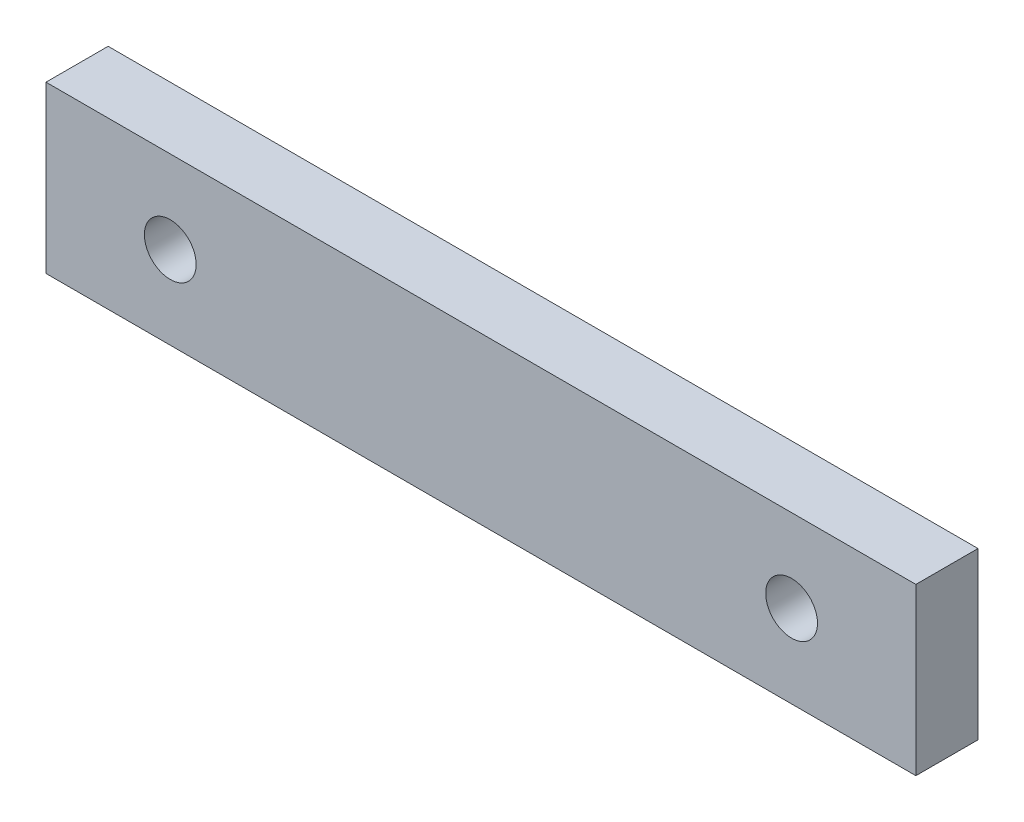
ISO-10303-21;
HEADER;
FILE_DESCRIPTION(('STEP AP214'),'2;1');
FILE_NAME('part.step','',(''),(''),'','','');
FILE_SCHEMA(('AUTOMOTIVE_DESIGN { 1 0 10303 214 1 1 1 1 }'));
ENDSEC;
DATA;
#1=APPLICATION_CONTEXT('core data for automotive mechanical design processes');
#2=APPLICATION_PROTOCOL_DEFINITION('international standard','automotive_design',2000,#1);
#3=PRODUCT_CONTEXT('',#1,'mechanical');
#4=PRODUCT('Part','Part','',(#3));
#5=PRODUCT_RELATED_PRODUCT_CATEGORY('part','',(#4));
#6=PRODUCT_DEFINITION_FORMATION('','',#4);
#7=PRODUCT_DEFINITION_CONTEXT('part definition',#1,'design');
#8=PRODUCT_DEFINITION('design','',#6,#7);
#9=PRODUCT_DEFINITION_SHAPE('','',#8);
#10=(LENGTH_UNIT() NAMED_UNIT(*) SI_UNIT(.MILLI.,.METRE.));
#11=(NAMED_UNIT(*) PLANE_ANGLE_UNIT() SI_UNIT($,.RADIAN.));
#12=(NAMED_UNIT(*) SI_UNIT($,.STERADIAN.) SOLID_ANGLE_UNIT());
#13=UNCERTAINTY_MEASURE_WITH_UNIT(LENGTH_MEASURE(1.E-05),#10,'distance_accuracy_value','');
#14=(GEOMETRIC_REPRESENTATION_CONTEXT(3) GLOBAL_UNCERTAINTY_ASSIGNED_CONTEXT((#13)) GLOBAL_UNIT_ASSIGNED_CONTEXT((#10,
#11,#12)) REPRESENTATION_CONTEXT('',''));
#15=CARTESIAN_POINT('',(0.,0.,0.));
#16=DIRECTION('',(0.,0.,1.));
#17=DIRECTION('',(1.,0.,0.));
#18=AXIS2_PLACEMENT_3D('',#15,#16,#17);
#19=CARTESIAN_POINT('',(0.,0.,15.));
#20=DIRECTION('',(0.,1.,0.));
#21=DIRECTION('',(0.,0.,1.));
#22=AXIS2_PLACEMENT_3D('',#19,#20,#21);
#23=PLANE('',#22);
#24=DIRECTION('',(1.,0.,0.));
#25=VECTOR('',#24,1.);
#26=CARTESIAN_POINT('',(0.,0.,0.));
#27=LINE('',#26,#25);
#28=CARTESIAN_POINT('',(0.,0.,0.));
#29=VERTEX_POINT('',#28);
#30=CARTESIAN_POINT('',(210.,0.,0.));
#31=VERTEX_POINT('',#30);
#32=EDGE_CURVE('E113',#29,#31,#27,.T.);
#33=ORIENTED_EDGE('',*,*,#32,.T.);
#34=DIRECTION('',(0.,0.,-1.));
#35=VECTOR('',#34,1.);
#36=CARTESIAN_POINT('',(210.,0.,15.));
#37=LINE('',#36,#35);
#38=CARTESIAN_POINT('',(210.,0.,15.));
#39=VERTEX_POINT('',#38);
#40=EDGE_CURVE('E11',#39,#31,#37,.T.);
#41=ORIENTED_EDGE('',*,*,#40,.F.);
#42=DIRECTION('',(1.,0.,0.));
#43=VECTOR('',#42,1.);
#44=CARTESIAN_POINT('',(0.,0.,15.));
#45=LINE('',#44,#43);
#46=CARTESIAN_POINT('',(0.,0.,15.));
#47=VERTEX_POINT('',#46);
#48=EDGE_CURVE('E95',#47,#39,#45,.T.);
#49=ORIENTED_EDGE('',*,*,#48,.F.);
#50=DIRECTION('',(0.,0.,-1.));
#51=VECTOR('',#50,1.);
#52=CARTESIAN_POINT('',(0.,0.,15.));
#53=LINE('',#52,#51);
#54=EDGE_CURVE('E62',#47,#29,#53,.T.);
#55=ORIENTED_EDGE('',*,*,#54,.T.);
#56=EDGE_LOOP('',(#33,#41,#49,#55));
#57=FACE_BOUND('',#56,.T.);
#58=ADVANCED_FACE('F45',(#57),#23,.F.);
#59=CARTESIAN_POINT('',(210.,0.,15.));
#60=DIRECTION('',(-1.,0.,0.));
#61=DIRECTION('',(0.,0.,1.));
#62=AXIS2_PLACEMENT_3D('',#59,#60,#61);
#63=PLANE('',#62);
#64=DIRECTION('',(0.,1.,0.));
#65=VECTOR('',#64,1.);
#66=CARTESIAN_POINT('',(210.,0.,0.));
#67=LINE('',#66,#65);
#68=CARTESIAN_POINT('',(210.,40.,0.));
#69=VERTEX_POINT('',#68);
#70=EDGE_CURVE('E101',#31,#69,#67,.T.);
#71=ORIENTED_EDGE('',*,*,#70,.T.);
#72=DIRECTION('',(0.,0.,-1.));
#73=VECTOR('',#72,1.);
#74=CARTESIAN_POINT('',(210.,40.,15.));
#75=LINE('',#74,#73);
#76=CARTESIAN_POINT('',(210.,40.,15.));
#77=VERTEX_POINT('',#76);
#78=EDGE_CURVE('E54',#77,#69,#75,.T.);
#79=ORIENTED_EDGE('',*,*,#78,.F.);
#80=DIRECTION('',(0.,1.,0.));
#81=VECTOR('',#80,1.);
#82=CARTESIAN_POINT('',(210.,0.,15.));
#83=LINE('',#82,#81);
#84=EDGE_CURVE('E87',#39,#77,#83,.T.);
#85=ORIENTED_EDGE('',*,*,#84,.F.);
#86=ORIENTED_EDGE('',*,*,#40,.T.);
#87=EDGE_LOOP('',(#71,#79,#85,#86));
#88=FACE_BOUND('',#87,.T.);
#89=ADVANCED_FACE('F100',(#88),#63,.F.);
#90=CARTESIAN_POINT('',(0.,40.,15.));
#91=DIRECTION('',(0.,1.,0.));
#92=DIRECTION('',(0.,0.,1.));
#93=AXIS2_PLACEMENT_3D('',#90,#91,#92);
#94=PLANE('',#93);
#95=DIRECTION('',(1.,0.,0.));
#96=VECTOR('',#95,1.);
#97=CARTESIAN_POINT('',(0.,40.,0.));
#98=LINE('',#97,#96);
#99=CARTESIAN_POINT('',(0.,40.,0.));
#100=VERTEX_POINT('',#99);
#101=EDGE_CURVE('E119',#100,#69,#98,.T.);
#102=ORIENTED_EDGE('',*,*,#101,.F.);
#103=DIRECTION('',(0.,0.,-1.));
#104=VECTOR('',#103,1.);
#105=CARTESIAN_POINT('',(0.,40.,15.));
#106=LINE('',#105,#104);
#107=CARTESIAN_POINT('',(0.,40.,15.));
#108=VERTEX_POINT('',#107);
#109=EDGE_CURVE('E76',#108,#100,#106,.T.);
#110=ORIENTED_EDGE('',*,*,#109,.F.);
#111=DIRECTION('',(1.,0.,0.));
#112=VECTOR('',#111,1.);
#113=CARTESIAN_POINT('',(0.,40.,15.));
#114=LINE('',#113,#112);
#115=EDGE_CURVE('E94',#108,#77,#114,.T.);
#116=ORIENTED_EDGE('',*,*,#115,.T.);
#117=ORIENTED_EDGE('',*,*,#78,.T.);
#118=EDGE_LOOP('',(#102,#110,#116,#117));
#119=FACE_BOUND('',#118,.T.);
#120=ADVANCED_FACE('F105',(#119),#94,.T.);
#121=CARTESIAN_POINT('',(0.,0.,15.));
#122=DIRECTION('',(-1.,0.,0.));
#123=DIRECTION('',(0.,0.,1.));
#124=AXIS2_PLACEMENT_3D('',#121,#122,#123);
#125=PLANE('',#124);
#126=DIRECTION('',(0.,1.,0.));
#127=VECTOR('',#126,1.);
#128=CARTESIAN_POINT('',(0.,0.,0.));
#129=LINE('',#128,#127);
#130=EDGE_CURVE('E122',#29,#100,#129,.T.);
#131=ORIENTED_EDGE('',*,*,#130,.F.);
#132=ORIENTED_EDGE('',*,*,#54,.F.);
#133=DIRECTION('',(0.,1.,0.));
#134=VECTOR('',#133,1.);
#135=CARTESIAN_POINT('',(0.,0.,15.));
#136=LINE('',#135,#134);
#137=EDGE_CURVE('E107',#47,#108,#136,.T.);
#138=ORIENTED_EDGE('',*,*,#137,.T.);
#139=ORIENTED_EDGE('',*,*,#109,.T.);
#140=EDGE_LOOP('',(#131,#132,#138,#139));
#141=FACE_BOUND('',#140,.T.);
#142=ADVANCED_FACE('F160',(#141),#125,.T.);
#143=CARTESIAN_POINT('',(0.,0.,15.));
#144=DIRECTION('',(0.,0.,1.));
#145=DIRECTION('',(1.,0.,0.));
#146=AXIS2_PLACEMENT_3D('',#143,#144,#145);
#147=PLANE('',#146);
#148=CARTESIAN_POINT('',(30.,20.,15.));
#149=DIRECTION('',(0.,0.,1.));
#150=DIRECTION('',(1.,0.,0.));
#151=AXIS2_PLACEMENT_3D('',#148,#149,#150);
#152=CIRCLE('',#151,6.25);
#153=CARTESIAN_POINT('',(36.25,20.,15.));
#154=VERTEX_POINT('',#153);
#155=EDGE_CURVE('E140',#154,#154,#152,.T.);
#156=ORIENTED_EDGE('',*,*,#155,.F.);
#157=EDGE_LOOP('',(#156));
#158=FACE_BOUND('',#157,.T.);
#159=CARTESIAN_POINT('',(180.,20.,15.));
#160=DIRECTION('',(0.,0.,1.));
#161=DIRECTION('',(1.,0.,0.));
#162=AXIS2_PLACEMENT_3D('',#159,#160,#161);
#163=CIRCLE('',#162,6.25);
#164=CARTESIAN_POINT('',(186.25,20.,15.));
#165=VERTEX_POINT('',#164);
#166=EDGE_CURVE('E136',#165,#165,#163,.T.);
#167=ORIENTED_EDGE('',*,*,#166,.F.);
#168=EDGE_LOOP('',(#167));
#169=FACE_BOUND('',#168,.T.);
#170=ORIENTED_EDGE('',*,*,#48,.T.);
#171=ORIENTED_EDGE('',*,*,#84,.T.);
#172=ORIENTED_EDGE('',*,*,#115,.F.);
#173=ORIENTED_EDGE('',*,*,#137,.F.);
#174=EDGE_LOOP('',(#170,#171,#172,#173));
#175=FACE_BOUND('',#174,.T.);
#176=ADVANCED_FACE('F91',(#158,#169,#175),#147,.T.);
#177=CARTESIAN_POINT('',(0.,0.,0.));
#178=DIRECTION('',(0.,0.,1.));
#179=DIRECTION('',(1.,0.,0.));
#180=AXIS2_PLACEMENT_3D('',#177,#178,#179);
#181=PLANE('',#180);
#182=CARTESIAN_POINT('',(30.,20.,0.));
#183=DIRECTION('',(0.,0.,1.));
#184=DIRECTION('',(1.,0.,0.));
#185=AXIS2_PLACEMENT_3D('',#182,#183,#184);
#186=CIRCLE('',#185,6.25);
#187=CARTESIAN_POINT('',(36.25,20.,0.));
#188=VERTEX_POINT('',#187);
#189=EDGE_CURVE('E116',#188,#188,#186,.T.);
#190=ORIENTED_EDGE('',*,*,#189,.T.);
#191=EDGE_LOOP('',(#190));
#192=FACE_BOUND('',#191,.T.);
#193=CARTESIAN_POINT('',(180.,20.,0.));
#194=DIRECTION('',(0.,0.,1.));
#195=DIRECTION('',(1.,0.,0.));
#196=AXIS2_PLACEMENT_3D('',#193,#194,#195);
#197=CIRCLE('',#196,6.25);
#198=CARTESIAN_POINT('',(186.25,20.,0.));
#199=VERTEX_POINT('',#198);
#200=EDGE_CURVE('E132',#199,#199,#197,.T.);
#201=ORIENTED_EDGE('',*,*,#200,.T.);
#202=EDGE_LOOP('',(#201));
#203=FACE_BOUND('',#202,.T.);
#204=ORIENTED_EDGE('',*,*,#32,.F.);
#205=ORIENTED_EDGE('',*,*,#130,.T.);
#206=ORIENTED_EDGE('',*,*,#101,.T.);
#207=ORIENTED_EDGE('',*,*,#70,.F.);
#208=EDGE_LOOP('',(#204,#205,#206,#207));
#209=FACE_BOUND('',#208,.T.);
#210=ADVANCED_FACE('F148',(#192,#203,#209),#181,.F.);
#211=CARTESIAN_POINT('',(180.,20.,0.));
#212=DIRECTION('',(0.,0.,1.));
#213=DIRECTION('',(1.,0.,0.));
#214=AXIS2_PLACEMENT_3D('',#211,#212,#213);
#215=CYLINDRICAL_SURFACE('',#214,6.25);
#216=ORIENTED_EDGE('',*,*,#200,.F.);
#217=EDGE_LOOP('',(#216));
#218=FACE_BOUND('',#217,.T.);
#219=ORIENTED_EDGE('',*,*,#166,.T.);
#220=EDGE_LOOP('',(#219));
#221=FACE_BOUND('',#220,.T.);
#222=ADVANCED_FACE('F154',(#218,#221),#215,.F.);
#223=CARTESIAN_POINT('',(30.,20.,0.));
#224=DIRECTION('',(0.,0.,1.));
#225=DIRECTION('',(1.,0.,0.));
#226=AXIS2_PLACEMENT_3D('',#223,#224,#225);
#227=CYLINDRICAL_SURFACE('',#226,6.25);
#228=ORIENTED_EDGE('',*,*,#189,.F.);
#229=EDGE_LOOP('',(#228));
#230=FACE_BOUND('',#229,.T.);
#231=ORIENTED_EDGE('',*,*,#155,.T.);
#232=EDGE_LOOP('',(#231));
#233=FACE_BOUND('',#232,.T.);
#234=ADVANCED_FACE('F151',(#230,#233),#227,.F.);
#235=CLOSED_SHELL('',(#58,#89,#120,#142,#176,#210,#222,#234));
#236=MANIFOLD_SOLID_BREP('B2',#235);
#237=ADVANCED_BREP_SHAPE_REPRESENTATION('',(#18,#236),#14);
#238=SHAPE_DEFINITION_REPRESENTATION(#9,#237);
ENDSEC;
END-ISO-10303-21;
